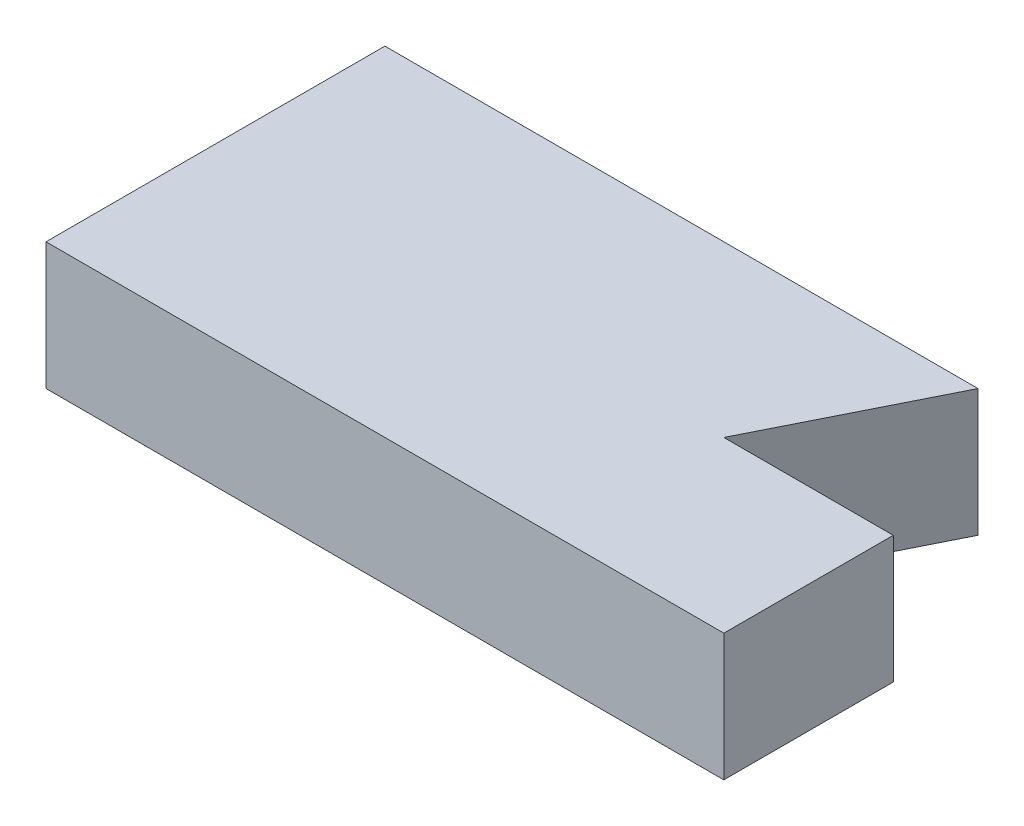
ISO-10303-21;
HEADER;
FILE_DESCRIPTION(('STEP AP214'),'2;1');
FILE_NAME('part.step','',(''),(''),'','','');
FILE_SCHEMA(('AUTOMOTIVE_DESIGN { 1 0 10303 214 1 1 1 1 }'));
ENDSEC;
DATA;
#1=APPLICATION_CONTEXT('core data for automotive mechanical design processes');
#2=APPLICATION_PROTOCOL_DEFINITION('international standard','automotive_design',2000,#1);
#3=PRODUCT_CONTEXT('',#1,'mechanical');
#4=PRODUCT('Part','Part','',(#3));
#5=PRODUCT_RELATED_PRODUCT_CATEGORY('part','',(#4));
#6=PRODUCT_DEFINITION_FORMATION('','',#4);
#7=PRODUCT_DEFINITION_CONTEXT('part definition',#1,'design');
#8=PRODUCT_DEFINITION('design','',#6,#7);
#9=PRODUCT_DEFINITION_SHAPE('','',#8);
#10=(LENGTH_UNIT() NAMED_UNIT(*) SI_UNIT(.MILLI.,.METRE.));
#11=(NAMED_UNIT(*) PLANE_ANGLE_UNIT() SI_UNIT($,.RADIAN.));
#12=(NAMED_UNIT(*) SI_UNIT($,.STERADIAN.) SOLID_ANGLE_UNIT());
#13=UNCERTAINTY_MEASURE_WITH_UNIT(LENGTH_MEASURE(1.E-05),#10,'distance_accuracy_value','');
#14=(GEOMETRIC_REPRESENTATION_CONTEXT(3) GLOBAL_UNCERTAINTY_ASSIGNED_CONTEXT((#13)) GLOBAL_UNIT_ASSIGNED_CONTEXT((#10,
#11,#12)) REPRESENTATION_CONTEXT('',''));
#15=CARTESIAN_POINT('',(0.,0.,0.));
#16=DIRECTION('',(0.,0.,1.));
#17=DIRECTION('',(1.,0.,0.));
#18=AXIS2_PLACEMENT_3D('',#15,#16,#17);
#19=CARTESIAN_POINT('',(0.,15.,-40.));
#20=DIRECTION('',(1.,0.,0.));
#21=DIRECTION('',(0.,0.,-1.));
#22=AXIS2_PLACEMENT_3D('',#19,#20,#21);
#23=PLANE('',#22);
#24=DIRECTION('',(0.,0.,1.));
#25=VECTOR('',#24,1.);
#26=CARTESIAN_POINT('',(0.,0.,-40.));
#27=LINE('',#26,#25);
#28=CARTESIAN_POINT('',(0.,0.,-40.));
#29=VERTEX_POINT('',#28);
#30=CARTESIAN_POINT('',(0.,0.,0.));
#31=VERTEX_POINT('',#30);
#32=EDGE_CURVE('E130',#29,#31,#27,.T.);
#33=ORIENTED_EDGE('',*,*,#32,.T.);
#34=DIRECTION('',(0.,-1.,0.));
#35=VECTOR('',#34,1.);
#36=CARTESIAN_POINT('',(0.,15.,0.));
#37=LINE('',#36,#35);
#38=CARTESIAN_POINT('',(0.,15.,0.));
#39=VERTEX_POINT('',#38);
#40=EDGE_CURVE('E11',#39,#31,#37,.T.);
#41=ORIENTED_EDGE('',*,*,#40,.F.);
#42=DIRECTION('',(0.,0.,1.));
#43=VECTOR('',#42,1.);
#44=CARTESIAN_POINT('',(0.,15.,-40.));
#45=LINE('',#44,#43);
#46=CARTESIAN_POINT('',(0.,15.,-40.));
#47=VERTEX_POINT('',#46);
#48=EDGE_CURVE('E140',#47,#39,#45,.T.);
#49=ORIENTED_EDGE('',*,*,#48,.F.);
#50=DIRECTION('',(0.,-1.,0.));
#51=VECTOR('',#50,1.);
#52=CARTESIAN_POINT('',(0.,15.,-40.));
#53=LINE('',#52,#51);
#54=EDGE_CURVE('E121',#47,#29,#53,.T.);
#55=ORIENTED_EDGE('',*,*,#54,.T.);
#56=EDGE_LOOP('',(#33,#41,#49,#55));
#57=FACE_BOUND('',#56,.T.);
#58=ADVANCED_FACE('F43',(#57),#23,.F.);
#59=CARTESIAN_POINT('',(0.,15.,0.));
#60=DIRECTION('',(0.,0.,-1.));
#61=DIRECTION('',(-1.,0.,0.));
#62=AXIS2_PLACEMENT_3D('',#59,#60,#61);
#63=PLANE('',#62);
#64=DIRECTION('',(1.,0.,0.));
#65=VECTOR('',#64,1.);
#66=CARTESIAN_POINT('',(0.,0.,0.));
#67=LINE('',#66,#65);
#68=CARTESIAN_POINT('',(80.,0.,0.));
#69=VERTEX_POINT('',#68);
#70=EDGE_CURVE('E127',#31,#69,#67,.T.);
#71=ORIENTED_EDGE('',*,*,#70,.T.);
#72=DIRECTION('',(0.,-1.,0.));
#73=VECTOR('',#72,1.);
#74=CARTESIAN_POINT('',(80.,15.,0.));
#75=LINE('',#74,#73);
#76=CARTESIAN_POINT('',(80.,15.,0.));
#77=VERTEX_POINT('',#76);
#78=EDGE_CURVE('E51',#77,#69,#75,.T.);
#79=ORIENTED_EDGE('',*,*,#78,.F.);
#80=DIRECTION('',(1.,0.,0.));
#81=VECTOR('',#80,1.);
#82=CARTESIAN_POINT('',(0.,15.,0.));
#83=LINE('',#82,#81);
#84=EDGE_CURVE('E96',#39,#77,#83,.T.);
#85=ORIENTED_EDGE('',*,*,#84,.F.);
#86=ORIENTED_EDGE('',*,*,#40,.T.);
#87=EDGE_LOOP('',(#71,#79,#85,#86));
#88=FACE_BOUND('',#87,.T.);
#89=ADVANCED_FACE('F161',(#88),#63,.F.);
#90=CARTESIAN_POINT('',(80.,15.,0.));
#91=DIRECTION('',(-1.,0.,0.));
#92=DIRECTION('',(0.,0.,1.));
#93=AXIS2_PLACEMENT_3D('',#90,#91,#92);
#94=PLANE('',#93);
#95=DIRECTION('',(0.,0.,-1.));
#96=VECTOR('',#95,1.);
#97=CARTESIAN_POINT('',(80.,0.,0.));
#98=LINE('',#97,#96);
#99=CARTESIAN_POINT('',(80.,0.,-20.));
#100=VERTEX_POINT('',#99);
#101=EDGE_CURVE('E135',#69,#100,#98,.T.);
#102=ORIENTED_EDGE('',*,*,#101,.T.);
#103=DIRECTION('',(0.,-1.,0.));
#104=VECTOR('',#103,1.);
#105=CARTESIAN_POINT('',(80.,15.,-20.));
#106=LINE('',#105,#104);
#107=CARTESIAN_POINT('',(80.,15.,-20.));
#108=VERTEX_POINT('',#107);
#109=EDGE_CURVE('E119',#108,#100,#106,.T.);
#110=ORIENTED_EDGE('',*,*,#109,.F.);
#111=DIRECTION('',(0.,0.,-1.));
#112=VECTOR('',#111,1.);
#113=CARTESIAN_POINT('',(80.,15.,0.));
#114=LINE('',#113,#112);
#115=EDGE_CURVE('E108',#77,#108,#114,.T.);
#116=ORIENTED_EDGE('',*,*,#115,.F.);
#117=ORIENTED_EDGE('',*,*,#78,.T.);
#118=EDGE_LOOP('',(#102,#110,#116,#117));
#119=FACE_BOUND('',#118,.T.);
#120=ADVANCED_FACE('F142',(#119),#94,.F.);
#121=CARTESIAN_POINT('',(80.,15.,-20.));
#122=DIRECTION('',(0.,0.,1.));
#123=DIRECTION('',(1.,0.,0.));
#124=AXIS2_PLACEMENT_3D('',#121,#122,#123);
#125=PLANE('',#124);
#126=DIRECTION('',(-1.,0.,0.));
#127=VECTOR('',#126,1.);
#128=CARTESIAN_POINT('',(80.,0.,-20.));
#129=LINE('',#128,#127);
#130=CARTESIAN_POINT('',(60.,0.,-20.));
#131=VERTEX_POINT('',#130);
#132=EDGE_CURVE('E117',#100,#131,#129,.T.);
#133=ORIENTED_EDGE('',*,*,#132,.T.);
#134=DIRECTION('',(0.,-1.,0.));
#135=VECTOR('',#134,1.);
#136=CARTESIAN_POINT('',(60.,15.,-20.));
#137=LINE('',#136,#135);
#138=CARTESIAN_POINT('',(60.,15.,-20.));
#139=VERTEX_POINT('',#138);
#140=EDGE_CURVE('E114',#139,#131,#137,.T.);
#141=ORIENTED_EDGE('',*,*,#140,.F.);
#142=DIRECTION('',(-1.,0.,0.));
#143=VECTOR('',#142,1.);
#144=CARTESIAN_POINT('',(80.,15.,-20.));
#145=LINE('',#144,#143);
#146=EDGE_CURVE('E104',#108,#139,#145,.T.);
#147=ORIENTED_EDGE('',*,*,#146,.F.);
#148=ORIENTED_EDGE('',*,*,#109,.T.);
#149=EDGE_LOOP('',(#133,#141,#147,#148));
#150=FACE_BOUND('',#149,.T.);
#151=ADVANCED_FACE('F113',(#150),#125,.F.);
#152=CARTESIAN_POINT('',(60.,15.,-20.));
#153=DIRECTION('',(-0.894427190999916,0.,-0.447213595499958));
#154=DIRECTION('',(-0.447213595499958,0.,0.894427190999916));
#155=AXIS2_PLACEMENT_3D('',#152,#153,#154);
#156=PLANE('',#155);
#157=DIRECTION('',(0.447213595499958,0.,-0.894427190999916));
#158=VECTOR('',#157,1.);
#159=CARTESIAN_POINT('',(60.,0.,-20.));
#160=LINE('',#159,#158);
#161=CARTESIAN_POINT('',(70.,0.,-40.));
#162=VERTEX_POINT('',#161);
#163=EDGE_CURVE('E85',#131,#162,#160,.T.);
#164=ORIENTED_EDGE('',*,*,#163,.T.);
#165=DIRECTION('',(0.,-1.,0.));
#166=VECTOR('',#165,1.);
#167=CARTESIAN_POINT('',(70.,15.,-40.));
#168=LINE('',#167,#166);
#169=CARTESIAN_POINT('',(70.,15.,-40.));
#170=VERTEX_POINT('',#169);
#171=EDGE_CURVE('E118',#170,#162,#168,.T.);
#172=ORIENTED_EDGE('',*,*,#171,.F.);
#173=DIRECTION('',(0.447213595499958,0.,-0.894427190999916));
#174=VECTOR('',#173,1.);
#175=CARTESIAN_POINT('',(60.,15.,-20.));
#176=LINE('',#175,#174);
#177=EDGE_CURVE('E107',#139,#170,#176,.T.);
#178=ORIENTED_EDGE('',*,*,#177,.F.);
#179=ORIENTED_EDGE('',*,*,#140,.T.);
#180=EDGE_LOOP('',(#164,#172,#178,#179));
#181=FACE_BOUND('',#180,.T.);
#182=ADVANCED_FACE('F123',(#181),#156,.F.);
#183=CARTESIAN_POINT('',(70.,15.,-40.));
#184=DIRECTION('',(0.,0.,1.));
#185=DIRECTION('',(1.,0.,0.));
#186=AXIS2_PLACEMENT_3D('',#183,#184,#185);
#187=PLANE('',#186);
#188=DIRECTION('',(-1.,0.,0.));
#189=VECTOR('',#188,1.);
#190=CARTESIAN_POINT('',(70.,0.,-40.));
#191=LINE('',#190,#189);
#192=EDGE_CURVE('E88',#162,#29,#191,.T.);
#193=ORIENTED_EDGE('',*,*,#192,.T.);
#194=ORIENTED_EDGE('',*,*,#54,.F.);
#195=DIRECTION('',(-1.,0.,0.));
#196=VECTOR('',#195,1.);
#197=CARTESIAN_POINT('',(70.,15.,-40.));
#198=LINE('',#197,#196);
#199=EDGE_CURVE('E56',#170,#47,#198,.T.);
#200=ORIENTED_EDGE('',*,*,#199,.F.);
#201=ORIENTED_EDGE('',*,*,#171,.T.);
#202=EDGE_LOOP('',(#193,#194,#200,#201));
#203=FACE_BOUND('',#202,.T.);
#204=ADVANCED_FACE('F148',(#203),#187,.F.);
#205=CARTESIAN_POINT('',(0.,15.,0.));
#206=DIRECTION('',(0.,1.,0.));
#207=DIRECTION('',(0.,0.,1.));
#208=AXIS2_PLACEMENT_3D('',#205,#206,#207);
#209=PLANE('',#208);
#210=ORIENTED_EDGE('',*,*,#48,.T.);
#211=ORIENTED_EDGE('',*,*,#84,.T.);
#212=ORIENTED_EDGE('',*,*,#115,.T.);
#213=ORIENTED_EDGE('',*,*,#146,.T.);
#214=ORIENTED_EDGE('',*,*,#177,.T.);
#215=ORIENTED_EDGE('',*,*,#199,.T.);
#216=EDGE_LOOP('',(#210,#211,#212,#213,#214,#215));
#217=FACE_BOUND('',#216,.T.);
#218=ADVANCED_FACE('F103',(#217),#209,.T.);
#219=CARTESIAN_POINT('',(0.,0.,0.));
#220=DIRECTION('',(0.,1.,0.));
#221=DIRECTION('',(0.,0.,1.));
#222=AXIS2_PLACEMENT_3D('',#219,#220,#221);
#223=PLANE('',#222);
#224=ORIENTED_EDGE('',*,*,#32,.F.);
#225=ORIENTED_EDGE('',*,*,#192,.F.);
#226=ORIENTED_EDGE('',*,*,#163,.F.);
#227=ORIENTED_EDGE('',*,*,#132,.F.);
#228=ORIENTED_EDGE('',*,*,#101,.F.);
#229=ORIENTED_EDGE('',*,*,#70,.F.);
#230=EDGE_LOOP('',(#224,#225,#226,#227,#228,#229));
#231=FACE_BOUND('',#230,.T.);
#232=ADVANCED_FACE('F147',(#231),#223,.F.);
#233=CLOSED_SHELL('',(#58,#89,#120,#151,#182,#204,#218,#232));
#234=MANIFOLD_SOLID_BREP('B2',#233);
#235=ADVANCED_BREP_SHAPE_REPRESENTATION('',(#18,#234),#14);
#236=SHAPE_DEFINITION_REPRESENTATION(#9,#235);
ENDSEC;
END-ISO-10303-21;
